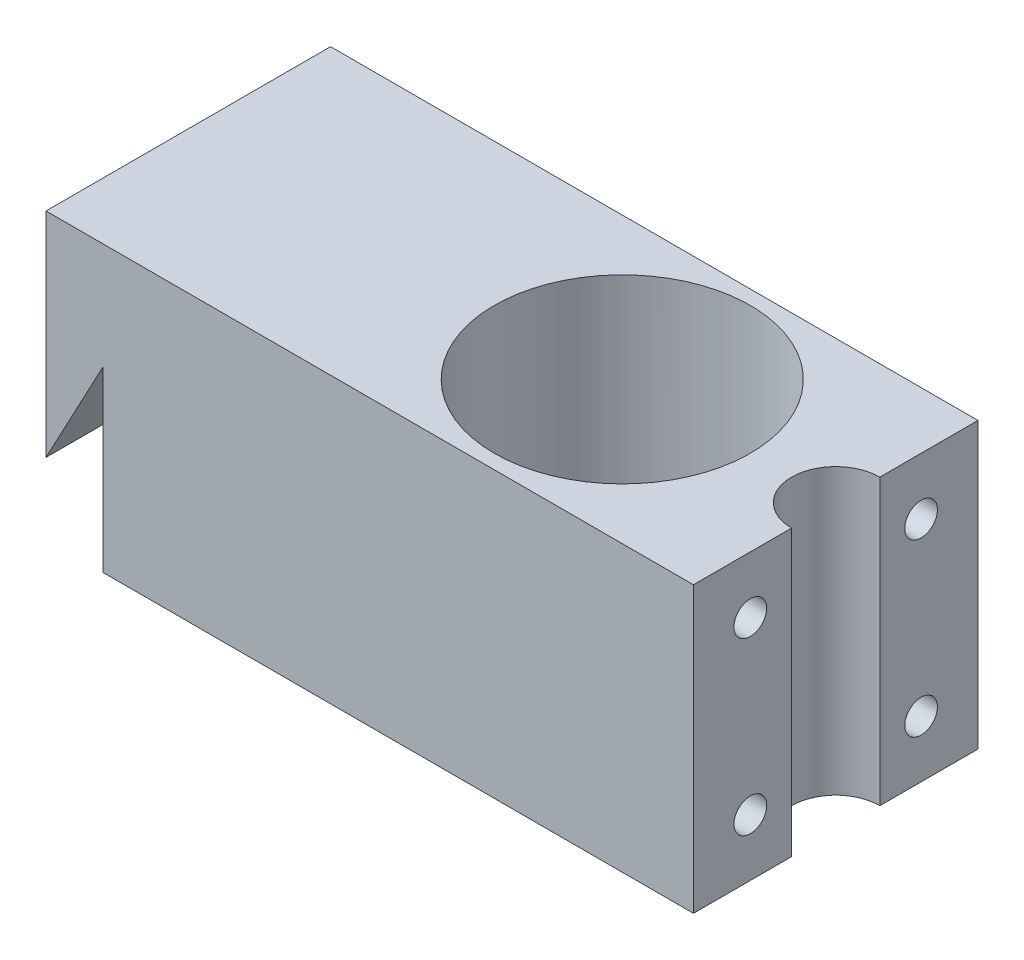
ISO-10303-21;
HEADER;
FILE_DESCRIPTION(('STEP AP214'),'2;1');
FILE_NAME('part.step','',(''),(''),'','','');
FILE_SCHEMA(('AUTOMOTIVE_DESIGN { 1 0 10303 214 1 1 1 1 }'));
ENDSEC;
DATA;
#1=APPLICATION_CONTEXT('core data for automotive mechanical design processes');
#2=APPLICATION_PROTOCOL_DEFINITION('international standard','automotive_design',2000,#1);
#3=PRODUCT_CONTEXT('',#1,'mechanical');
#4=PRODUCT('Part','Part','',(#3));
#5=PRODUCT_RELATED_PRODUCT_CATEGORY('part','',(#4));
#6=PRODUCT_DEFINITION_FORMATION('','',#4);
#7=PRODUCT_DEFINITION_CONTEXT('part definition',#1,'design');
#8=PRODUCT_DEFINITION('design','',#6,#7);
#9=PRODUCT_DEFINITION_SHAPE('','',#8);
#10=(LENGTH_UNIT() NAMED_UNIT(*) SI_UNIT(.MILLI.,.METRE.));
#11=(NAMED_UNIT(*) PLANE_ANGLE_UNIT() SI_UNIT($,.RADIAN.));
#12=(NAMED_UNIT(*) SI_UNIT($,.STERADIAN.) SOLID_ANGLE_UNIT());
#13=UNCERTAINTY_MEASURE_WITH_UNIT(LENGTH_MEASURE(1.E-05),#10,'distance_accuracy_value','');
#14=(GEOMETRIC_REPRESENTATION_CONTEXT(3) GLOBAL_UNCERTAINTY_ASSIGNED_CONTEXT((#13)) GLOBAL_UNIT_ASSIGNED_CONTEXT((#10,
#11,#12)) REPRESENTATION_CONTEXT('',''));
#15=CARTESIAN_POINT('',(0.,0.,0.));
#16=DIRECTION('',(0.,0.,1.));
#17=DIRECTION('',(1.,0.,0.));
#18=AXIS2_PLACEMENT_3D('',#15,#16,#17);
#19=CARTESIAN_POINT('',(25.5,-10.,10.));
#20=DIRECTION('',(-1.,0.,0.));
#21=DIRECTION('',(0.,0.,1.));
#22=AXIS2_PLACEMENT_3D('',#19,#20,#21);
#23=PLANE('',#22);
#24=CARTESIAN_POINT('',(25.5,-6.,6.));
#25=DIRECTION('',(1.,0.,0.));
#26=DIRECTION('',(0.,0.,-1.));
#27=AXIS2_PLACEMENT_3D('',#24,#25,#26);
#28=CIRCLE('',#27,1.15);
#29=CARTESIAN_POINT('',(25.5,-6.,4.85));
#30=VERTEX_POINT('',#29);
#31=EDGE_CURVE('E307',#30,#30,#28,.T.);
#32=ORIENTED_EDGE('',*,*,#31,.F.);
#33=EDGE_LOOP('',(#32));
#34=FACE_BOUND('',#33,.T.);
#35=CARTESIAN_POINT('',(25.5,6.,6.));
#36=DIRECTION('',(1.,0.,0.));
#37=DIRECTION('',(0.,0.,-1.));
#38=AXIS2_PLACEMENT_3D('',#35,#36,#37);
#39=CIRCLE('',#38,1.15);
#40=CARTESIAN_POINT('',(25.5,6.,4.85));
#41=VERTEX_POINT('',#40);
#42=EDGE_CURVE('E192',#41,#41,#39,.T.);
#43=ORIENTED_EDGE('',*,*,#42,.F.);
#44=EDGE_LOOP('',(#43));
#45=FACE_BOUND('',#44,.T.);
#46=DIRECTION('',(0.,0.,-1.));
#47=VECTOR('',#46,1.);
#48=CARTESIAN_POINT('',(25.5,-10.,10.));
#49=LINE('',#48,#47);
#50=CARTESIAN_POINT('',(25.5,-10.,10.));
#51=VERTEX_POINT('',#50);
#52=CARTESIAN_POINT('',(25.5,-10.,3.1));
#53=VERTEX_POINT('',#52);
#54=EDGE_CURVE('E58',#51,#53,#49,.T.);
#55=ORIENTED_EDGE('',*,*,#54,.T.);
#56=DIRECTION('',(0.,1.,0.));
#57=VECTOR('',#56,1.);
#58=CARTESIAN_POINT('',(25.5,-10.001,3.1));
#59=LINE('',#58,#57);
#60=CARTESIAN_POINT('',(25.5,10.,3.1));
#61=VERTEX_POINT('',#60);
#62=EDGE_CURVE('E292',#61,#53,#59,.F.);
#63=ORIENTED_EDGE('',*,*,#62,.F.);
#64=DIRECTION('',(0.,0.,-1.));
#65=VECTOR('',#64,1.);
#66=CARTESIAN_POINT('',(25.5,10.,10.));
#67=LINE('',#66,#65);
#68=CARTESIAN_POINT('',(25.5,10.,10.));
#69=VERTEX_POINT('',#68);
#70=EDGE_CURVE('E176',#69,#61,#67,.T.);
#71=ORIENTED_EDGE('',*,*,#70,.F.);
#72=DIRECTION('',(0.,1.,0.));
#73=VECTOR('',#72,1.);
#74=CARTESIAN_POINT('',(25.5,-10.,10.));
#75=LINE('',#74,#73);
#76=EDGE_CURVE('E126',#51,#69,#75,.T.);
#77=ORIENTED_EDGE('',*,*,#76,.F.);
#78=EDGE_LOOP('',(#55,#63,#71,#77));
#79=FACE_BOUND('',#78,.T.);
#80=ADVANCED_FACE('F43',(#34,#45,#79),#23,.F.);
#81=CARTESIAN_POINT('',(-16.0000000000001,2.5,10.));
#82=DIRECTION('',(1.,0.,0.));
#83=DIRECTION('',(0.,1.,0.));
#84=AXIS2_PLACEMENT_3D('',#81,#82,#83);
#85=PLANE('',#84);
#86=DIRECTION('',(0.,-1.,0.));
#87=VECTOR('',#86,1.);
#88=CARTESIAN_POINT('',(-16.0000000000001,2.5,-10.));
#89=LINE('',#88,#87);
#90=CARTESIAN_POINT('',(-16.0000000000001,2.5,-10.));
#91=VERTEX_POINT('',#90);
#92=CARTESIAN_POINT('',(-16.,-9.99999999999999,-10.));
#93=VERTEX_POINT('',#92);
#94=EDGE_CURVE('E151',#91,#93,#89,.T.);
#95=ORIENTED_EDGE('',*,*,#94,.T.);
#96=DIRECTION('',(0.,0.,-1.));
#97=VECTOR('',#96,1.);
#98=CARTESIAN_POINT('',(-16.,-9.99999999999999,10.));
#99=LINE('',#98,#97);
#100=CARTESIAN_POINT('',(-16.,-9.99999999999999,10.));
#101=VERTEX_POINT('',#100);
#102=EDGE_CURVE('E11',#101,#93,#99,.T.);
#103=ORIENTED_EDGE('',*,*,#102,.F.);
#104=DIRECTION('',(0.,-1.,0.));
#105=VECTOR('',#104,1.);
#106=CARTESIAN_POINT('',(-16.0000000000001,2.5,10.));
#107=LINE('',#106,#105);
#108=CARTESIAN_POINT('',(-16.0000000000001,2.5,10.));
#109=VERTEX_POINT('',#108);
#110=EDGE_CURVE('E171',#109,#101,#107,.T.);
#111=ORIENTED_EDGE('',*,*,#110,.F.);
#112=DIRECTION('',(0.,0.,-1.));
#113=VECTOR('',#112,1.);
#114=CARTESIAN_POINT('',(-16.0000000000001,2.5,10.));
#115=LINE('',#114,#113);
#116=EDGE_CURVE('E147',#109,#91,#115,.T.);
#117=ORIENTED_EDGE('',*,*,#116,.T.);
#118=EDGE_LOOP('',(#95,#103,#111,#117));
#119=FACE_BOUND('',#118,.T.);
#120=ADVANCED_FACE('F45',(#119),#85,.F.);
#121=CARTESIAN_POINT('',(-16.,-9.99999999999999,10.));
#122=DIRECTION('',(0.,1.,0.));
#123=DIRECTION('',(-1.,0.,0.));
#124=AXIS2_PLACEMENT_3D('',#121,#122,#123);
#125=PLANE('',#124);
#126=CARTESIAN_POINT('',(10.4999999999999,-10.,0.));
#127=DIRECTION('',(0.,1.,0.));
#128=DIRECTION('',(-1.,0.,0.));
#129=AXIS2_PLACEMENT_3D('',#126,#127,#128);
#130=CIRCLE('',#129,9.);
#131=CARTESIAN_POINT('',(1.49999999999995,-10.,0.));
#132=VERTEX_POINT('',#131);
#133=EDGE_CURVE('E156',#132,#132,#130,.F.);
#134=ORIENTED_EDGE('',*,*,#133,.F.);
#135=EDGE_LOOP('',(#134));
#136=FACE_BOUND('',#135,.T.);
#137=CARTESIAN_POINT('',(25.5,-10.,-3.1));
#138=VERTEX_POINT('',#137);
#139=CARTESIAN_POINT('',(25.5,-10.,-10.));
#140=VERTEX_POINT('',#139);
#141=EDGE_CURVE('E179',#138,#140,#49,.T.);
#142=ORIENTED_EDGE('',*,*,#141,.F.);
#143=CARTESIAN_POINT('',(25.5,-10.,0.));
#144=DIRECTION('',(0.,1.,0.));
#145=DIRECTION('',(-1.,0.,0.));
#146=AXIS2_PLACEMENT_3D('',#143,#144,#145);
#147=CIRCLE('',#146,3.1);
#148=EDGE_CURVE('E284',#53,#138,#147,.F.);
#149=ORIENTED_EDGE('',*,*,#148,.F.);
#150=ORIENTED_EDGE('',*,*,#54,.F.);
#151=DIRECTION('',(1.,0.,0.));
#152=VECTOR('',#151,1.);
#153=CARTESIAN_POINT('',(-16.,-9.99999999999999,10.));
#154=LINE('',#153,#152);
#155=EDGE_CURVE('E110',#101,#51,#154,.T.);
#156=ORIENTED_EDGE('',*,*,#155,.F.);
#157=ORIENTED_EDGE('',*,*,#102,.T.);
#158=DIRECTION('',(1.,0.,0.));
#159=VECTOR('',#158,1.);
#160=CARTESIAN_POINT('',(-16.,-9.99999999999999,-10.));
#161=LINE('',#160,#159);
#162=EDGE_CURVE('E155',#93,#140,#161,.T.);
#163=ORIENTED_EDGE('',*,*,#162,.T.);
#164=EDGE_LOOP('',(#142,#149,#150,#156,#157,#163));
#165=FACE_BOUND('',#164,.T.);
#166=ADVANCED_FACE('F245',(#136,#165),#125,.F.);
#167=CARTESIAN_POINT('',(25.5,6.,-6.));
#168=DIRECTION('',(1.,0.,0.));
#169=DIRECTION('',(0.,0.,-1.));
#170=AXIS2_PLACEMENT_3D('',#167,#168,#169);
#171=CIRCLE('',#170,1.15);
#172=CARTESIAN_POINT('',(25.5,6.,-7.15));
#173=VERTEX_POINT('',#172);
#174=EDGE_CURVE('E261',#173,#173,#171,.T.);
#175=ORIENTED_EDGE('',*,*,#174,.F.);
#176=EDGE_LOOP('',(#175));
#177=FACE_BOUND('',#176,.T.);
#178=CARTESIAN_POINT('',(25.5,-6.,-6.));
#179=DIRECTION('',(1.,0.,0.));
#180=DIRECTION('',(0.,0.,-1.));
#181=AXIS2_PLACEMENT_3D('',#178,#179,#180);
#182=CIRCLE('',#181,1.15);
#183=CARTESIAN_POINT('',(25.5,-6.,-7.15));
#184=VERTEX_POINT('',#183);
#185=EDGE_CURVE('E265',#184,#184,#182,.T.);
#186=ORIENTED_EDGE('',*,*,#185,.F.);
#187=EDGE_LOOP('',(#186));
#188=FACE_BOUND('',#187,.T.);
#189=CARTESIAN_POINT('',(25.5,10.,-3.1));
#190=VERTEX_POINT('',#189);
#191=CARTESIAN_POINT('',(25.5,10.,-10.));
#192=VERTEX_POINT('',#191);
#193=EDGE_CURVE('E140',#190,#192,#67,.T.);
#194=ORIENTED_EDGE('',*,*,#193,.F.);
#195=DIRECTION('',(0.,1.,0.));
#196=VECTOR('',#195,1.);
#197=CARTESIAN_POINT('',(25.5,-10.001,-3.1));
#198=LINE('',#197,#196);
#199=EDGE_CURVE('E66',#138,#190,#198,.T.);
#200=ORIENTED_EDGE('',*,*,#199,.F.);
#201=ORIENTED_EDGE('',*,*,#141,.T.);
#202=DIRECTION('',(0.,1.,0.));
#203=VECTOR('',#202,1.);
#204=CARTESIAN_POINT('',(25.5,-10.,-10.));
#205=LINE('',#204,#203);
#206=EDGE_CURVE('E160',#140,#192,#205,.T.);
#207=ORIENTED_EDGE('',*,*,#206,.T.);
#208=EDGE_LOOP('',(#194,#200,#201,#207));
#209=FACE_BOUND('',#208,.T.);
#210=ADVANCED_FACE('F239',(#177,#188,#209),#23,.F.);
#211=CARTESIAN_POINT('',(25.5,10.,10.));
#212=DIRECTION('',(0.,-1.,0.));
#213=DIRECTION('',(1.,0.,0.));
#214=AXIS2_PLACEMENT_3D('',#211,#212,#213);
#215=PLANE('',#214);
#216=CARTESIAN_POINT('',(10.4999999999999,10.,0.));
#217=DIRECTION('',(0.,1.,0.));
#218=DIRECTION('',(0.,0.,1.));
#219=AXIS2_PLACEMENT_3D('',#216,#217,#218);
#220=CIRCLE('',#219,9.);
#221=CARTESIAN_POINT('',(10.4999999999999,10.,9.));
#222=VERTEX_POINT('',#221);
#223=EDGE_CURVE('E288',#222,#222,#220,.T.);
#224=ORIENTED_EDGE('',*,*,#223,.F.);
#225=EDGE_LOOP('',(#224));
#226=FACE_BOUND('',#225,.T.);
#227=ORIENTED_EDGE('',*,*,#70,.T.);
#228=CARTESIAN_POINT('',(25.5,10.,0.));
#229=DIRECTION('',(0.,1.,0.));
#230=DIRECTION('',(0.,0.,1.));
#231=AXIS2_PLACEMENT_3D('',#228,#229,#230);
#232=CIRCLE('',#231,3.1);
#233=EDGE_CURVE('E289',#190,#61,#232,.T.);
#234=ORIENTED_EDGE('',*,*,#233,.F.);
#235=ORIENTED_EDGE('',*,*,#193,.T.);
#236=DIRECTION('',(-1.,0.,0.));
#237=VECTOR('',#236,1.);
#238=CARTESIAN_POINT('',(25.5,10.,-10.));
#239=LINE('',#238,#237);
#240=CARTESIAN_POINT('',(-20.,9.99999999999999,-10.));
#241=VERTEX_POINT('',#240);
#242=EDGE_CURVE('E136',#192,#241,#239,.T.);
#243=ORIENTED_EDGE('',*,*,#242,.T.);
#244=DIRECTION('',(0.,0.,-1.));
#245=VECTOR('',#244,1.);
#246=CARTESIAN_POINT('',(-20.,9.99999999999999,10.));
#247=LINE('',#246,#245);
#248=CARTESIAN_POINT('',(-20.,9.99999999999999,10.));
#249=VERTEX_POINT('',#248);
#250=EDGE_CURVE('E133',#249,#241,#247,.T.);
#251=ORIENTED_EDGE('',*,*,#250,.F.);
#252=DIRECTION('',(-1.,0.,0.));
#253=VECTOR('',#252,1.);
#254=CARTESIAN_POINT('',(25.5,10.,10.));
#255=LINE('',#254,#253);
#256=EDGE_CURVE('E119',#69,#249,#255,.T.);
#257=ORIENTED_EDGE('',*,*,#256,.F.);
#258=EDGE_LOOP('',(#227,#234,#235,#243,#251,#257));
#259=FACE_BOUND('',#258,.T.);
#260=ADVANCED_FACE('F134',(#226,#259),#215,.F.);
#261=CARTESIAN_POINT('',(-20.,9.99999999999999,10.));
#262=DIRECTION('',(1.,0.,0.));
#263=DIRECTION('',(0.,0.,-1.));
#264=AXIS2_PLACEMENT_3D('',#261,#262,#263);
#265=PLANE('',#264);
#266=DIRECTION('',(0.,-1.,0.));
#267=VECTOR('',#266,1.);
#268=CARTESIAN_POINT('',(-20.,9.99999999999999,-10.));
#269=LINE('',#268,#267);
#270=CARTESIAN_POINT('',(-20.,-4.99999999999999,-10.));
#271=VERTEX_POINT('',#270);
#272=EDGE_CURVE('E166',#241,#271,#269,.T.);
#273=ORIENTED_EDGE('',*,*,#272,.T.);
#274=DIRECTION('',(0.,0.,-1.));
#275=VECTOR('',#274,1.);
#276=CARTESIAN_POINT('',(-20.,-4.99999999999999,10.));
#277=LINE('',#276,#275);
#278=CARTESIAN_POINT('',(-20.,-4.99999999999999,10.));
#279=VERTEX_POINT('',#278);
#280=EDGE_CURVE('E141',#279,#271,#277,.T.);
#281=ORIENTED_EDGE('',*,*,#280,.F.);
#282=DIRECTION('',(0.,-1.,0.));
#283=VECTOR('',#282,1.);
#284=CARTESIAN_POINT('',(-20.,9.99999999999999,10.));
#285=LINE('',#284,#283);
#286=EDGE_CURVE('E123',#249,#279,#285,.T.);
#287=ORIENTED_EDGE('',*,*,#286,.F.);
#288=ORIENTED_EDGE('',*,*,#250,.T.);
#289=EDGE_LOOP('',(#273,#281,#287,#288));
#290=FACE_BOUND('',#289,.T.);
#291=ADVANCED_FACE('F143',(#290),#265,.F.);
#292=CARTESIAN_POINT('',(-20.,-4.99999999999999,10.));
#293=DIRECTION('',(-0.882352941176474,0.47058823529411,0.));
#294=DIRECTION('',(-0.470588235294111,-0.882352941176475,0.));
#295=AXIS2_PLACEMENT_3D('',#292,#293,#294);
#296=PLANE('',#295);
#297=DIRECTION('',(0.47058823529411,0.882352941176474,0.));
#298=VECTOR('',#297,1.);
#299=CARTESIAN_POINT('',(-20.,-4.99999999999999,-10.));
#300=LINE('',#299,#298);
#301=EDGE_CURVE('E102',#271,#91,#300,.T.);
#302=ORIENTED_EDGE('',*,*,#301,.T.);
#303=ORIENTED_EDGE('',*,*,#116,.F.);
#304=DIRECTION('',(0.47058823529411,0.882352941176474,0.));
#305=VECTOR('',#304,1.);
#306=CARTESIAN_POINT('',(-20.,-4.99999999999999,10.));
#307=LINE('',#306,#305);
#308=EDGE_CURVE('E75',#279,#109,#307,.T.);
#309=ORIENTED_EDGE('',*,*,#308,.F.);
#310=ORIENTED_EDGE('',*,*,#280,.T.);
#311=EDGE_LOOP('',(#302,#303,#309,#310));
#312=FACE_BOUND('',#311,.T.);
#313=ADVANCED_FACE('F277',(#312),#296,.F.);
#314=CARTESIAN_POINT('',(0.,0.,10.));
#315=DIRECTION('',(0.,0.,1.));
#316=DIRECTION('',(1.,0.,0.));
#317=AXIS2_PLACEMENT_3D('',#314,#315,#316);
#318=PLANE('',#317);
#319=ORIENTED_EDGE('',*,*,#110,.T.);
#320=ORIENTED_EDGE('',*,*,#155,.T.);
#321=ORIENTED_EDGE('',*,*,#76,.T.);
#322=ORIENTED_EDGE('',*,*,#256,.T.);
#323=ORIENTED_EDGE('',*,*,#286,.T.);
#324=ORIENTED_EDGE('',*,*,#308,.T.);
#325=EDGE_LOOP('',(#319,#320,#321,#322,#323,#324));
#326=FACE_BOUND('',#325,.T.);
#327=ADVANCED_FACE('F121',(#326),#318,.T.);
#328=CARTESIAN_POINT('',(0.,0.,-10.));
#329=DIRECTION('',(0.,0.,1.));
#330=DIRECTION('',(1.,0.,0.));
#331=AXIS2_PLACEMENT_3D('',#328,#329,#330);
#332=PLANE('',#331);
#333=ORIENTED_EDGE('',*,*,#94,.F.);
#334=ORIENTED_EDGE('',*,*,#301,.F.);
#335=ORIENTED_EDGE('',*,*,#272,.F.);
#336=ORIENTED_EDGE('',*,*,#242,.F.);
#337=ORIENTED_EDGE('',*,*,#206,.F.);
#338=ORIENTED_EDGE('',*,*,#162,.F.);
#339=EDGE_LOOP('',(#333,#334,#335,#336,#337,#338));
#340=FACE_BOUND('',#339,.T.);
#341=ADVANCED_FACE('F276',(#340),#332,.F.);
#342=CARTESIAN_POINT('',(25.5,-10.001,0.));
#343=DIRECTION('',(0.,1.,0.));
#344=DIRECTION('',(0.,0.,1.));
#345=AXIS2_PLACEMENT_3D('',#342,#343,#344);
#346=CYLINDRICAL_SURFACE('',#345,3.1);
#347=ORIENTED_EDGE('',*,*,#62,.T.);
#348=ORIENTED_EDGE('',*,*,#148,.T.);
#349=ORIENTED_EDGE('',*,*,#199,.T.);
#350=ORIENTED_EDGE('',*,*,#233,.T.);
#351=EDGE_LOOP('',(#347,#348,#349,#350));
#352=FACE_BOUND('',#351,.T.);
#353=ADVANCED_FACE('F317',(#352),#346,.F.);
#354=CARTESIAN_POINT('',(10.4999999999999,-10.001,0.));
#355=DIRECTION('',(0.,1.,0.));
#356=DIRECTION('',(0.,0.,1.));
#357=AXIS2_PLACEMENT_3D('',#354,#355,#356);
#358=CYLINDRICAL_SURFACE('',#357,9.);
#359=CARTESIAN_POINT('',(15.9660314671615,6.,-7.15));
#360=CARTESIAN_POINT('',(15.9660394606917,6.04810864538917,-7.14999458318255));
#361=CARTESIAN_POINT('',(15.9700367461879,6.09626515916895,-7.14694348603548));
#362=CARTESIAN_POINT('',(15.98548769309,6.19065404627445,-7.13509013053239));
#363=CARTESIAN_POINT('',(15.9969569772585,6.23688217167912,-7.12627582207606));
#364=CARTESIAN_POINT('',(16.0258411211232,6.32553504254716,-7.1039006438662));
#365=CARTESIAN_POINT('',(16.0431869292486,6.36799704187106,-7.09039485622625));
#366=CARTESIAN_POINT('',(16.0824365895949,6.44919552087034,-7.05953451958653));
#367=CARTESIAN_POINT('',(16.1043422180108,6.4879305401453,-7.04217847061385));
#368=CARTESIAN_POINT('',(16.1657048528361,6.58382373760782,-6.99300413468881));
#369=CARTESIAN_POINT('',(16.2077935331096,6.63804911086695,-6.95876625045929));
#370=CARTESIAN_POINT('',(16.2971434147921,6.73756550959318,-6.884514647776));
#371=CARTESIAN_POINT('',(16.3444194524526,6.78282981283289,-6.84448425241573));
#372=CARTESIAN_POINT('',(16.4644467603052,6.88408278640531,-6.7404900876486));
#373=CARTESIAN_POINT('',(16.5389154828209,6.93543095217591,-6.67398564115379));
#374=CARTESIAN_POINT('',(16.6903446612919,7.02193740333729,-6.53378466397801));
#375=CARTESIAN_POINT('',(16.7673073469108,7.05708074850775,-6.4600815719706));
#376=CARTESIAN_POINT('',(16.9230394561145,7.11183278900748,-6.30530536070699));
#377=CARTESIAN_POINT('',(17.0018107476614,7.13107601887361,-6.22410416840132));
#378=CARTESIAN_POINT('',(17.1572470588262,7.15161254771259,-6.05755686410284));
#379=CARTESIAN_POINT('',(17.2339141897998,7.15292454942484,-5.97221516405243));
#380=CARTESIAN_POINT('',(17.369289723375,7.13732510626106,-5.81562896858516));
#381=CARTESIAN_POINT('',(17.4287104893912,7.12371611226082,-5.74467383475882));
#382=CARTESIAN_POINT('',(17.5433150979417,7.08200509936126,-5.60356396150805));
#383=CARTESIAN_POINT('',(17.598503798963,7.05391999435838,-5.53340838544303));
#384=CARTESIAN_POINT('',(17.6926023408491,6.98923016609829,-5.41029131927706));
#385=CARTESIAN_POINT('',(17.7325712045042,6.9554153947979,-5.35667686831525));
#386=CARTESIAN_POINT('',(17.8076619110724,6.87738222834981,-5.25377180165774));
#387=CARTESIAN_POINT('',(17.842789006038,6.83317524917883,-5.20447652228635));
#388=CARTESIAN_POINT('',(17.902045000896,6.74224197228061,-5.11976395159099));
#389=CARTESIAN_POINT('',(17.9270347513204,6.696979567221,-5.08338089310015));
#390=CARTESIAN_POINT('',(17.9720305236695,6.59973832647014,-5.01700790792318));
#391=CARTESIAN_POINT('',(17.9920379470792,6.54776138578107,-4.98701618375377));
#392=CARTESIAN_POINT('',(18.0264807498145,6.43788550103512,-4.93488364772603));
#393=CARTESIAN_POINT('',(18.0408844186719,6.37995513471937,-4.91278757144108));
#394=CARTESIAN_POINT('',(18.0633833190781,6.26015095551142,-4.87808042706362));
#395=CARTESIAN_POINT('',(18.0714816878252,6.19827912029401,-4.86546464216705));
#396=CARTESIAN_POINT('',(18.0805419188523,6.07927107145306,-4.85133431822312));
#397=CARTESIAN_POINT('',(18.0821516609939,6.02230163847673,-4.84881215817422));
#398=CARTESIAN_POINT('',(18.079970053278,5.90873176429521,-4.85222207212399));
#399=CARTESIAN_POINT('',(18.0761803903954,5.85213121338728,-4.85815150553084));
#400=CARTESIAN_POINT('',(18.0635880170998,5.74317422426716,-4.87773125493251));
#401=CARTESIAN_POINT('',(18.0549853910099,5.69073831970341,-4.89107327009689));
#402=CARTESIAN_POINT('',(18.0331897148973,5.58911433578404,-4.92457607068286));
#403=CARTESIAN_POINT('',(18.0199962831438,5.53992652691614,-4.94473742313638));
#404=CARTESIAN_POINT('',(17.9887248453098,5.4437775123302,-4.99197688376506));
#405=CARTESIAN_POINT('',(17.9704579812817,5.39700858925289,-5.01931957745087));
#406=CARTESIAN_POINT('',(17.9298410666448,5.3089439886218,-5.07924904804782));
#407=CARTESIAN_POINT('',(17.9074895637273,5.26765026683626,-5.11183768968291));
#408=CARTESIAN_POINT('',(17.8564867481868,5.18661403470749,-5.18500771071706));
#409=CARTESIAN_POINT('',(17.8274079566403,5.14758302623066,-5.22607663703891));
#410=CARTESIAN_POINT('',(17.7655651934967,5.07704149377938,-5.31171889355702));
#411=CARTESIAN_POINT('',(17.7327993131144,5.04553489174413,-5.35629403527398));
#412=CARTESIAN_POINT('',(17.6583319241544,4.98512230851228,-5.45552519871537));
#413=CARTESIAN_POINT('',(17.6160634032288,4.95759899495026,-5.51059514091128));
#414=CARTESIAN_POINT('',(17.528305747214,4.91219536338854,-5.62209641836471));
#415=CARTESIAN_POINT('',(17.4828146708969,4.89432091459541,-5.67852856046889));
#416=CARTESIAN_POINT('',(17.3794734191549,4.86472664812119,-5.80350981483837));
#417=CARTESIAN_POINT('',(17.3210510022481,4.85512155788225,-5.87208575642357));
#418=CARTESIAN_POINT('',(17.2018411587463,4.84801763525284,-6.00778746017404));
#419=CARTESIAN_POINT('',(17.1410518873978,4.85052844138596,-6.07491202507872));
#420=CARTESIAN_POINT('',(17.0051388535552,4.86848274531281,-6.22053535515711));
#421=CARTESIAN_POINT('',(16.9297085135779,4.88655535796193,-6.29842827333566));
#422=CARTESIAN_POINT('',(16.7787613412297,4.93824899734236,-6.44891631125626));
#423=CARTESIAN_POINT('',(16.7032444882881,4.97188260573105,-6.52150708892087));
#424=CARTESIAN_POINT('',(16.5641628536397,5.0493053225605,-6.65084602670386));
#425=CARTESIAN_POINT('',(16.5003203620881,5.0912062396133,-6.70842701214039));
#426=CARTESIAN_POINT('',(16.3765985866355,5.18748912316306,-6.81705991093822));
#427=CARTESIAN_POINT('',(16.3167113714875,5.24184507104224,-6.8681250943925));
#428=CARTESIAN_POINT('',(16.2255601336383,5.34154388940361,-6.94406790988485));
#429=CARTESIAN_POINT('',(16.1919440874376,5.38270113546732,-6.97161450212403));
#430=CARTESIAN_POINT('',(16.1292935598787,5.47086342042312,-7.02229768088814));
#431=CARTESIAN_POINT('',(16.1002530911778,5.51786067083677,-7.04544003893374));
#432=CARTESIAN_POINT('',(16.0547131666847,5.60645418622912,-7.08137057966124));
#433=CARTESIAN_POINT('',(16.0368624669081,5.64687743846672,-7.095316828231));
#434=CARTESIAN_POINT('',(16.0065016224045,5.73085205361523,-7.11890526178536));
#435=CARTESIAN_POINT('',(15.9939799469486,5.77439642199302,-7.12855674170373));
#436=CARTESIAN_POINT('',(15.9786068960334,5.84852338623441,-7.14037293243283));
#437=CARTESIAN_POINT('',(15.9739169664512,5.87850524632107,-7.14396596188106));
#438=CARTESIAN_POINT('',(15.9676265575364,5.93898494853418,-7.14878133585678));
#439=CARTESIAN_POINT('',(15.9660263965591,5.96948284350392,-7.15000343609479));
#440=CARTESIAN_POINT('',(15.9660314671615,6.,-7.15));
#441=B_SPLINE_CURVE_WITH_KNOTS('',3,(#359,#360,#361,#362,#363,#364,#365,#366,#367,#368,#369,
#370,#371,#372,#373,#374,#375,#376,#377,#378,#379,#380,#381,#382,#383,#384,#385,#386,#387,#388,
#389,#390,#391,#392,#393,#394,#395,#396,#397,#398,#399,#400,#401,#402,#403,#404,#405,#406,#407,
#408,#409,#410,#411,#412,#413,#414,#415,#416,#417,#418,#419,#420,#421,#422,#423,#424,#425,#426,
#427,#428,#429,#430,#431,#432,#433,#434,#435,#436,#437,#438,#439,#440),.UNSPECIFIED.,.T.,.F.,(4,
2,2,2,2,2,2,2,2,2,2,2,2,2,2,2,2,2,2,2,2,2,2,2,2,2,2,2,2,2,2,2,2,2,2,2,2,2,2,2,4),(0.,
0.144168235792563,0.288638876091866,0.431467637938625,0.574352140595051,0.803181255176676,
1.03268279455068,1.36772376283196,1.7030730113784,2.04593125627073,2.38843186373236,
2.66803290616319,2.94730800062927,3.17125792172379,3.39496297110029,3.58383786521839,
3.77265957031501,3.96253475400968,4.15231540494613,4.32259252681567,4.49281645944584,
4.65643977803314,4.82007670534234,4.99089077976147,5.16176570634986,5.35208935382723,
5.54251198805919,5.76573361673332,5.98909087398034,6.25990708564631,6.53093877444182,
6.85943443137085,7.18819615495264,7.47422636228484,7.75966441240302,7.93876982361753,
8.11763888546415,8.25616037198746,8.39438058831625,8.48582260115864,8.57727403525857),.UNSPECIFIED.);
#442=CARTESIAN_POINT('',(15.9660314671615,6.,-7.15));
#443=VERTEX_POINT('',#442);
#444=EDGE_CURVE('E47',#443,#443,#441,.T.);
#445=ORIENTED_EDGE('',*,*,#444,.T.);
#446=EDGE_LOOP('',(#445));
#447=FACE_BOUND('',#446,.T.);
#448=CARTESIAN_POINT('',(15.9660314671615,-6.,-7.15));
#449=CARTESIAN_POINT('',(15.9660394606917,-5.95189135461083,-7.14999458318255));
#450=CARTESIAN_POINT('',(15.9700367461879,-5.90373484083104,-7.14694348603548));
#451=CARTESIAN_POINT('',(15.98548769309,-5.80934595372555,-7.13509013053239));
#452=CARTESIAN_POINT('',(15.9969569772585,-5.76311782832088,-7.12627582207606));
#453=CARTESIAN_POINT('',(16.0258411211232,-5.67446495745284,-7.1039006438662));
#454=CARTESIAN_POINT('',(16.0431869292486,-5.63200295812893,-7.09039485622625));
#455=CARTESIAN_POINT('',(16.0824365895949,-5.55080447912966,-7.05953451958653));
#456=CARTESIAN_POINT('',(16.1043422180108,-5.5120694598547,-7.04217847061385));
#457=CARTESIAN_POINT('',(16.1657048528361,-5.41617626239217,-6.99300413468881));
#458=CARTESIAN_POINT('',(16.2077935331096,-5.36195088913305,-6.95876625045929));
#459=CARTESIAN_POINT('',(16.2971434147921,-5.26243449040682,-6.884514647776));
#460=CARTESIAN_POINT('',(16.3444194524526,-5.21717018716711,-6.84448425241573));
#461=CARTESIAN_POINT('',(16.4644467603052,-5.11591721359468,-6.7404900876486));
#462=CARTESIAN_POINT('',(16.5389154828209,-5.06456904782409,-6.67398564115379));
#463=CARTESIAN_POINT('',(16.6903446612919,-4.97806259666271,-6.53378466397801));
#464=CARTESIAN_POINT('',(16.7673073469108,-4.94291925149225,-6.4600815719706));
#465=CARTESIAN_POINT('',(16.9230394561145,-4.88816721099252,-6.30530536070699));
#466=CARTESIAN_POINT('',(17.0018107476614,-4.86892398112638,-6.22410416840132));
#467=CARTESIAN_POINT('',(17.1572470588262,-4.84838745228741,-6.05755686410284));
#468=CARTESIAN_POINT('',(17.2339141897998,-4.84707545057515,-5.97221516405243));
#469=CARTESIAN_POINT('',(17.369289723375,-4.86267489373894,-5.81562896858516));
#470=CARTESIAN_POINT('',(17.4287104893912,-4.87628388773917,-5.74467383475882));
#471=CARTESIAN_POINT('',(17.5433150979417,-4.91799490063874,-5.60356396150805));
#472=CARTESIAN_POINT('',(17.598503798963,-4.94608000564162,-5.53340838544303));
#473=CARTESIAN_POINT('',(17.6926023408491,-5.0107698339017,-5.41029131927706));
#474=CARTESIAN_POINT('',(17.7325712045042,-5.0445846052021,-5.35667686831525));
#475=CARTESIAN_POINT('',(17.8076619110724,-5.12261777165019,-5.25377180165774));
#476=CARTESIAN_POINT('',(17.842789006038,-5.16682475082117,-5.20447652228635));
#477=CARTESIAN_POINT('',(17.902045000896,-5.25775802771938,-5.11976395159099));
#478=CARTESIAN_POINT('',(17.9270347513204,-5.30302043277899,-5.08338089310015));
#479=CARTESIAN_POINT('',(17.9720305236695,-5.40026167352986,-5.01700790792318));
#480=CARTESIAN_POINT('',(17.9920379470792,-5.45223861421893,-4.98701618375377));
#481=CARTESIAN_POINT('',(18.0264807498145,-5.56211449896488,-4.93488364772603));
#482=CARTESIAN_POINT('',(18.0408844186719,-5.62004486528063,-4.91278757144108));
#483=CARTESIAN_POINT('',(18.0633833190781,-5.73984904448858,-4.87808042706362));
#484=CARTESIAN_POINT('',(18.0714816878252,-5.80172087970599,-4.86546464216705));
#485=CARTESIAN_POINT('',(18.0805419188523,-5.92072892854694,-4.85133431822312));
#486=CARTESIAN_POINT('',(18.0821516609939,-5.97769836152327,-4.84881215817422));
#487=CARTESIAN_POINT('',(18.079970053278,-6.09126823570479,-4.85222207212399));
#488=CARTESIAN_POINT('',(18.0761803903954,-6.14786878661272,-4.85815150553084));
#489=CARTESIAN_POINT('',(18.0635880170998,-6.25682577573284,-4.87773125493251));
#490=CARTESIAN_POINT('',(18.0549853910099,-6.30926168029658,-4.89107327009689));
#491=CARTESIAN_POINT('',(18.0331897148973,-6.41088566421596,-4.92457607068286));
#492=CARTESIAN_POINT('',(18.0199962831438,-6.46007347308386,-4.94473742313638));
#493=CARTESIAN_POINT('',(17.9887248453098,-6.5562224876698,-4.99197688376506));
#494=CARTESIAN_POINT('',(17.9704579812817,-6.60299141074711,-5.01931957745087));
#495=CARTESIAN_POINT('',(17.9298410666448,-6.69105601137819,-5.07924904804782));
#496=CARTESIAN_POINT('',(17.9074895637273,-6.73234973316373,-5.11183768968291));
#497=CARTESIAN_POINT('',(17.8564867481868,-6.81338596529251,-5.18500771071706));
#498=CARTESIAN_POINT('',(17.8274079566403,-6.85241697376933,-5.22607663703891));
#499=CARTESIAN_POINT('',(17.7655651934967,-6.92295850622061,-5.31171889355702));
#500=CARTESIAN_POINT('',(17.7327993131144,-6.95446510825586,-5.35629403527398));
#501=CARTESIAN_POINT('',(17.6583319241544,-7.01487769148771,-5.45552519871537));
#502=CARTESIAN_POINT('',(17.6160634032288,-7.04240100504973,-5.51059514091128));
#503=CARTESIAN_POINT('',(17.528305747214,-7.08780463661146,-5.62209641836471));
#504=CARTESIAN_POINT('',(17.4828146708969,-7.10567908540459,-5.67852856046889));
#505=CARTESIAN_POINT('',(17.3794734191549,-7.13527335187881,-5.80350981483837));
#506=CARTESIAN_POINT('',(17.3210510022481,-7.14487844211775,-5.87208575642357));
#507=CARTESIAN_POINT('',(17.2018411587463,-7.15198236474716,-6.00778746017404));
#508=CARTESIAN_POINT('',(17.1410518873978,-7.14947155861404,-6.07491202507872));
#509=CARTESIAN_POINT('',(17.0051388535552,-7.13151725468719,-6.22053535515711));
#510=CARTESIAN_POINT('',(16.9297085135779,-7.11344464203806,-6.29842827333566));
#511=CARTESIAN_POINT('',(16.7787613412297,-7.06175100265763,-6.44891631125626));
#512=CARTESIAN_POINT('',(16.7032444882881,-7.02811739426895,-6.52150708892087));
#513=CARTESIAN_POINT('',(16.5641628536397,-6.95069467743949,-6.65084602670386));
#514=CARTESIAN_POINT('',(16.5003203620881,-6.9087937603867,-6.70842701214039));
#515=CARTESIAN_POINT('',(16.3765985866355,-6.81251087683694,-6.81705991093822));
#516=CARTESIAN_POINT('',(16.3167113714875,-6.75815492895776,-6.8681250943925));
#517=CARTESIAN_POINT('',(16.2255601336383,-6.65845611059639,-6.94406790988485));
#518=CARTESIAN_POINT('',(16.1919440874376,-6.61729886453268,-6.97161450212403));
#519=CARTESIAN_POINT('',(16.1292935598787,-6.52913657957687,-7.02229768088814));
#520=CARTESIAN_POINT('',(16.1002530911778,-6.48213932916323,-7.04544003893374));
#521=CARTESIAN_POINT('',(16.0547131666847,-6.39354581377087,-7.08137057966124));
#522=CARTESIAN_POINT('',(16.0368624669081,-6.35312256153327,-7.095316828231));
#523=CARTESIAN_POINT('',(16.0065016224045,-6.26914794638476,-7.11890526178536));
#524=CARTESIAN_POINT('',(15.9939799469486,-6.22560357800698,-7.12855674170373));
#525=CARTESIAN_POINT('',(15.9786068960334,-6.15147661376559,-7.14037293243283));
#526=CARTESIAN_POINT('',(15.9739169664512,-6.12149475367893,-7.14396596188106));
#527=CARTESIAN_POINT('',(15.9676265575364,-6.06101505146582,-7.14878133585678));
#528=CARTESIAN_POINT('',(15.9660263965591,-6.03051715649608,-7.15000343609479));
#529=CARTESIAN_POINT('',(15.9660314671615,-6.,-7.15));
#530=B_SPLINE_CURVE_WITH_KNOTS('',3,(#448,#449,#450,#451,#452,#453,#454,#455,#456,#457,#458,
#459,#460,#461,#462,#463,#464,#465,#466,#467,#468,#469,#470,#471,#472,#473,#474,#475,#476,#477,
#478,#479,#480,#481,#482,#483,#484,#485,#486,#487,#488,#489,#490,#491,#492,#493,#494,#495,#496,
#497,#498,#499,#500,#501,#502,#503,#504,#505,#506,#507,#508,#509,#510,#511,#512,#513,#514,#515,
#516,#517,#518,#519,#520,#521,#522,#523,#524,#525,#526,#527,#528,#529),.UNSPECIFIED.,.T.,.F.,(4,
2,2,2,2,2,2,2,2,2,2,2,2,2,2,2,2,2,2,2,2,2,2,2,2,2,2,2,2,2,2,2,2,2,2,2,2,2,2,2,4),(0.,
0.144168235792563,0.288638876091866,0.431467637938625,0.574352140595051,0.803181255176676,
1.03268279455068,1.36772376283196,1.7030730113784,2.04593125627073,2.38843186373236,
2.66803290616319,2.94730800062927,3.1712579217238,3.39496297110029,3.58383786521839,
3.77265957031501,3.96253475400968,4.15231540494613,4.32259252681567,4.49281645944584,
4.65643977803314,4.82007670534234,4.99089077976147,5.16176570634986,5.35208935382723,
5.54251198805919,5.76573361673332,5.98909087398034,6.25990708564631,6.53093877444182,
6.85943443137085,7.18819615495264,7.47422636228484,7.75966441240302,7.93876982361753,
8.11763888546415,8.25616037198746,8.39438058831625,8.48582260115864,8.57727403525857),.UNSPECIFIED.);
#531=CARTESIAN_POINT('',(15.9660314671615,-6.,-7.15));
#532=VERTEX_POINT('',#531);
#533=EDGE_CURVE('E215',#532,#532,#530,.T.);
#534=ORIENTED_EDGE('',*,*,#533,.T.);
#535=EDGE_LOOP('',(#534));
#536=FACE_BOUND('',#535,.T.);
#537=CARTESIAN_POINT('',(18.0813916928226,-6.,4.85));
#538=CARTESIAN_POINT('',(18.0813900119372,-5.94333113468828,4.85000362748289));
#539=CARTESIAN_POINT('',(18.0787004074526,-5.88660704020097,4.85421493110327));
#540=CARTESIAN_POINT('',(18.0680262286238,-5.77483720937554,4.87083890919859));
#541=CARTESIAN_POINT('',(18.0600335543719,-5.7197941754273,4.883264129502));
#542=CARTESIAN_POINT('',(18.0390560849896,-5.61316337880503,4.91558744038361));
#543=CARTESIAN_POINT('',(18.0260872917551,-5.56156515658825,4.9354615725106));
#544=CARTESIAN_POINT('',(17.9955674733674,-5.46286274628889,4.98168963731276));
#545=CARTESIAN_POINT('',(17.9780169271303,-5.41575808921052,5.00804289272909));
#546=CARTESIAN_POINT('',(17.9378893383679,-5.32475224720861,5.06745920941625));
#547=CARTESIAN_POINT('',(17.9151132361199,-5.28110927760883,5.10078140117321));
#548=CARTESIAN_POINT('',(17.8656690208344,-5.2001895314368,5.17192398134116));
#549=CARTESIAN_POINT('',(17.8389996143646,-5.16291487951171,5.20974586386235));
#550=CARTESIAN_POINT('',(17.7783157802629,-5.09007171702428,5.29425984659011));
#551=CARTESIAN_POINT('',(17.743796221821,-5.055502222554,5.3414480895333));
#552=CARTESIAN_POINT('',(17.6712484205216,-4.99478405084766,5.43846322678085));
#553=CARTESIAN_POINT('',(17.6332170467091,-4.96864298305504,5.48829245846376));
#554=CARTESIAN_POINT('',(17.5360856205271,-4.91418703536678,5.6126854714956));
#555=CARTESIAN_POINT('',(17.47538109438,-4.89046574051862,5.68802317341049));
#556=CARTESIAN_POINT('',(17.3498818735616,-4.85878418298703,5.83855932043219));
#557=CARTESIAN_POINT('',(17.2850821285548,-4.85084378912903,5.91375747104602));
#558=CARTESIAN_POINT('',(17.1521080803026,-4.84927380404354,6.06296665206666));
#559=CARTESIAN_POINT('',(17.0839009765876,-4.85583058730017,6.13694975922492));
#560=CARTESIAN_POINT('',(16.9462979955916,-4.88252534477538,6.28133976988534));
#561=CARTESIAN_POINT('',(16.8769008257138,-4.90267913544711,6.35174240579641));
#562=CARTESIAN_POINT('',(16.7251401789571,-4.96113259893263,6.50084024773294));
#563=CARTESIAN_POINT('',(16.6428256792949,-5.00215815617387,6.57855940914603));
#564=CARTESIAN_POINT('',(16.5223130994441,-5.07773764909089,6.68840281734247));
#565=CARTESIAN_POINT('',(16.4826489682994,-5.10525876771248,6.7238833481622));
#566=CARTESIAN_POINT('',(16.4048799043849,-5.16521808703859,6.79227946991313));
#567=CARTESIAN_POINT('',(16.3667736931391,-5.19765214882723,6.82519718488079));
#568=CARTESIAN_POINT('',(16.2904806921432,-5.27006724924378,6.89006549369567));
#569=CARTESIAN_POINT('',(16.2524531889589,-5.31040418660216,6.92181035611392));
#570=CARTESIAN_POINT('',(16.1805517275228,-5.39748493481775,6.98093752385834));
#571=CARTESIAN_POINT('',(16.1466718200827,-5.44421936041037,7.00832609501503));
#572=CARTESIAN_POINT('',(16.0918733112065,-5.53360143401747,7.05208542173484));
#573=CARTESIAN_POINT('',(16.0697358726881,-5.57495038528546,7.06955813367305));
#574=CARTESIAN_POINT('',(16.0308120065351,-5.66164007493061,7.10005148606247));
#575=CARTESIAN_POINT('',(16.014017380421,-5.70697455976454,7.11307894994391));
#576=CARTESIAN_POINT('',(15.9898198120116,-5.79227274249195,7.13176486531546));
#577=CARTESIAN_POINT('',(15.9812616248607,-5.83170452962455,7.13833476937419));
#578=CARTESIAN_POINT('',(15.9695394450686,-5.91182231709654,7.14732083209246));
#579=CARTESIAN_POINT('',(15.9663710678007,-5.95250727052043,7.14974036710319));
#580=CARTESIAN_POINT('',(15.9657435575168,-6.03401018369039,7.15022011604092));
#581=CARTESIAN_POINT('',(15.9682930415693,-6.07482825149037,7.14827375036283));
#582=CARTESIAN_POINT('',(15.9788542619575,-6.15532510752848,7.14018193798799));
#583=CARTESIAN_POINT('',(15.9868700391475,-6.19500303030739,7.13403338489593));
#584=CARTESIAN_POINT('',(16.0099987713836,-6.28099154355691,7.11619060731352));
#585=CARTESIAN_POINT('',(16.0263036589155,-6.32678300014003,7.10355918757979));
#586=CARTESIAN_POINT('',(16.0644197674471,-6.41440651049688,7.07374146809112));
#587=CARTESIAN_POINT('',(16.0862409558126,-6.45623120659366,7.05654692042138));
#588=CARTESIAN_POINT('',(16.1447651358141,-6.55383738627684,7.00989124758095));
#589=CARTESIAN_POINT('',(16.1837177841127,-6.60729095764469,6.97841127206905));
#590=CARTESIAN_POINT('',(16.2668523256856,-6.70586629401503,6.90987315347186));
#591=CARTESIAN_POINT('',(16.3110459638834,-6.75096874263102,6.87280242919796));
#592=CARTESIAN_POINT('',(16.4248059005125,-6.85356827788287,6.77529648541445));
#593=CARTESIAN_POINT('',(16.4962815371383,-6.90646583177415,6.7122501332179));
#594=CARTESIAN_POINT('',(16.6421703921787,-6.99684955720058,6.57902463221398));
#595=CARTESIAN_POINT('',(16.7165867944835,-7.0343184941103,6.50883761539632));
#596=CARTESIAN_POINT('',(16.8680384663756,-7.09494406487666,6.36078611415627));
#597=CARTESIAN_POINT('',(16.9450891531928,-7.11767521058124,6.28276275115519));
#598=CARTESIAN_POINT('',(17.0976837177807,-7.14637162023298,6.12231991154197));
#599=CARTESIAN_POINT('',(17.1732287080205,-7.15234975523823,6.03990385939688));
#600=CARTESIAN_POINT('',(17.3111064691235,-7.14640857785704,5.88372464645408));
#601=CARTESIAN_POINT('',(17.3738662948472,-7.13674916898341,5.81025660978901));
#602=CARTESIAN_POINT('',(17.495298237422,-7.10223062639857,5.66346446350142));
#603=CARTESIAN_POINT('',(17.5539747611512,-7.07738817142411,5.59014028439514));
#604=CARTESIAN_POINT('',(17.654010245414,-7.01794588890511,5.46126215492995));
#605=CARTESIAN_POINT('',(17.6964528313243,-6.98639208386945,5.40514783974224));
#606=CARTESIAN_POINT('',(17.7765386853043,-6.91233411392684,5.29683873314369));
#607=CARTESIAN_POINT('',(17.8141877383516,-6.86984333894179,5.24463924908813));
#608=CARTESIAN_POINT('',(17.8778443755867,-6.78173297562631,5.15460503379987));
#609=CARTESIAN_POINT('',(17.9047495750642,-6.73774249849131,5.11581421699223));
#610=CARTESIAN_POINT('',(17.953596831598,-6.64251612629062,5.04437978024791));
#611=CARTESIAN_POINT('',(17.9755384975826,-6.59127966083727,5.01173664471481));
#612=CARTESIAN_POINT('',(18.0138265091633,-6.48221521917737,4.95415201861377));
#613=CARTESIAN_POINT('',(18.030133758324,-6.42434475619473,4.92926445519034));
#614=CARTESIAN_POINT('',(18.0562613124218,-6.30404800109035,4.88912052986779));
#615=CARTESIAN_POINT('',(18.0660966196398,-6.2416326203339,4.87384189765882));
#616=CARTESIAN_POINT('',(18.0754536761909,-6.14876124336485,4.85927213725274));
#617=CARTESIAN_POINT('',(18.0776774410672,-6.11916467256534,4.85580188550451));
#618=CARTESIAN_POINT('',(18.0806468619841,-6.05971717436833,4.85116490826024));
#619=CARTESIAN_POINT('',(18.0813925787016,-6.02986625746279,4.84999808820351));
#620=CARTESIAN_POINT('',(18.0813916928226,-6.,4.85));
#621=B_SPLINE_CURVE_WITH_KNOTS('',3,(#537,#538,#539,#540,#541,#542,#543,#544,#545,#546,#547,
#548,#549,#550,#551,#552,#553,#554,#555,#556,#557,#558,#559,#560,#561,#562,#563,#564,#565,#566,
#567,#568,#569,#570,#571,#572,#573,#574,#575,#576,#577,#578,#579,#580,#581,#582,#583,#584,#585,
#586,#587,#588,#589,#590,#591,#592,#593,#594,#595,#596,#597,#598,#599,#600,#601,#602,#603,#604,
#605,#606,#607,#608,#609,#610,#611,#612,#613,#614,#615,#616,#617,#618,#619,#620),.UNSPECIFIED.,
.T.,.F.,(4,2,2,2,2,2,2,2,2,2,2,2,2,2,2,2,2,2,2,2,2,2,2,2,2,2,2,2,2,2,2,2,2,2,2,2,2,2,2,2,2,4),
(0.,0.169887265583049,0.340034616138413,0.509639341854803,0.679226346423812,0.856863664304012,
1.03456013167128,1.23756367804343,1.4407499923786,1.73797675469261,2.03557750166578,
2.33702639629766,2.63882655143697,2.99813347650903,3.17765973096782,3.35703557590041,
3.54819989023993,3.73908670895677,3.88873013026554,4.03814280543393,4.16025884438658,
4.28227549398109,4.4044761515766,4.52676724177021,4.67660419550577,4.8267138482926,
5.04524461793497,5.26427470785593,5.58954632672212,5.91518031283041,6.24984007909504,
6.58424266127361,6.87447124394825,7.16438157906785,7.39483475714787,7.62500712679419,
7.81779473984322,8.0105975371492,8.20471249503811,8.39837588474759,8.48791544218539,
8.57745132376062),.UNSPECIFIED.);
#622=CARTESIAN_POINT('',(18.0813916928226,-6.,4.85));
#623=VERTEX_POINT('',#622);
#624=EDGE_CURVE('E191',#623,#623,#621,.T.);
#625=ORIENTED_EDGE('',*,*,#624,.T.);
#626=EDGE_LOOP('',(#625));
#627=FACE_BOUND('',#626,.T.);
#628=CARTESIAN_POINT('',(18.0813916928226,6.,4.85));
#629=CARTESIAN_POINT('',(18.0813900119372,6.05666886531172,4.85000362748289));
#630=CARTESIAN_POINT('',(18.0787004074526,6.11339295979903,4.85421493110327));
#631=CARTESIAN_POINT('',(18.0680262286238,6.22516279062445,4.87083890919859));
#632=CARTESIAN_POINT('',(18.0600335543719,6.2802058245727,4.883264129502));
#633=CARTESIAN_POINT('',(18.0390560849896,6.38683662119496,4.91558744038361));
#634=CARTESIAN_POINT('',(18.0260872917551,6.43843484341175,4.9354615725106));
#635=CARTESIAN_POINT('',(17.9955674733674,6.53713725371111,4.98168963731276));
#636=CARTESIAN_POINT('',(17.9780169271303,6.58424191078947,5.00804289272909));
#637=CARTESIAN_POINT('',(17.9378893383679,6.67524775279139,5.06745920941625));
#638=CARTESIAN_POINT('',(17.9151132361199,6.71889072239116,5.10078140117321));
#639=CARTESIAN_POINT('',(17.8656690208344,6.79981046856319,5.17192398134116));
#640=CARTESIAN_POINT('',(17.8389996143646,6.83708512048829,5.20974586386235));
#641=CARTESIAN_POINT('',(17.7783157802629,6.90992828297571,5.29425984659011));
#642=CARTESIAN_POINT('',(17.743796221821,6.94449777744599,5.3414480895333));
#643=CARTESIAN_POINT('',(17.6712484205216,7.00521594915234,5.43846322678085));
#644=CARTESIAN_POINT('',(17.6332170467091,7.03135701694496,5.48829245846376));
#645=CARTESIAN_POINT('',(17.5360856205271,7.08581296463322,5.6126854714956));
#646=CARTESIAN_POINT('',(17.47538109438,7.10953425948138,5.68802317341049));
#647=CARTESIAN_POINT('',(17.3498818735616,7.14121581701297,5.83855932043219));
#648=CARTESIAN_POINT('',(17.2850821285548,7.14915621087097,5.91375747104602));
#649=CARTESIAN_POINT('',(17.1521080803026,7.15072619595646,6.06296665206666));
#650=CARTESIAN_POINT('',(17.0839009765876,7.14416941269983,6.13694975922492));
#651=CARTESIAN_POINT('',(16.9462979955916,7.11747465522462,6.28133976988534));
#652=CARTESIAN_POINT('',(16.8769008257138,7.09732086455289,6.35174240579641));
#653=CARTESIAN_POINT('',(16.7251401789571,7.03886740106737,6.50084024773294));
#654=CARTESIAN_POINT('',(16.6428256792949,6.99784184382612,6.57855940914603));
#655=CARTESIAN_POINT('',(16.5223130994441,6.92226235090911,6.68840281734247));
#656=CARTESIAN_POINT('',(16.4826489682994,6.89474123228751,6.7238833481622));
#657=CARTESIAN_POINT('',(16.4048799043849,6.8347819129614,6.79227946991313));
#658=CARTESIAN_POINT('',(16.3667736931391,6.80234785117276,6.82519718488079));
#659=CARTESIAN_POINT('',(16.2904806921432,6.72993275075622,6.89006549369567));
#660=CARTESIAN_POINT('',(16.2524531889589,6.68959581339784,6.92181035611392));
#661=CARTESIAN_POINT('',(16.1805517275228,6.60251506518225,6.98093752385834));
#662=CARTESIAN_POINT('',(16.1466718200827,6.55578063958963,7.00832609501503));
#663=CARTESIAN_POINT('',(16.0918733112065,6.46639856598253,7.05208542173484));
#664=CARTESIAN_POINT('',(16.0697358726881,6.42504961471454,7.06955813367305));
#665=CARTESIAN_POINT('',(16.0308120065351,6.33835992506939,7.10005148606247));
#666=CARTESIAN_POINT('',(16.014017380421,6.29302544023546,7.11307894994391));
#667=CARTESIAN_POINT('',(15.9898198120116,6.20772725750804,7.13176486531546));
#668=CARTESIAN_POINT('',(15.9812616248607,6.16829547037544,7.13833476937419));
#669=CARTESIAN_POINT('',(15.9695394450686,6.08817768290346,7.14732083209246));
#670=CARTESIAN_POINT('',(15.9663710678007,6.04749272947956,7.14974036710319));
#671=CARTESIAN_POINT('',(15.9657435575168,5.96598981630961,7.15022011604092));
#672=CARTESIAN_POINT('',(15.9682930415693,5.92517174850963,7.14827375036283));
#673=CARTESIAN_POINT('',(15.9788542619575,5.84467489247152,7.14018193798799));
#674=CARTESIAN_POINT('',(15.9868700391475,5.8049969696926,7.13403338489593));
#675=CARTESIAN_POINT('',(16.0099987713836,5.71900845644308,7.11619060731352));
#676=CARTESIAN_POINT('',(16.0263036589155,5.67321699985996,7.10355918757979));
#677=CARTESIAN_POINT('',(16.0644197674471,5.58559348950311,7.07374146809112));
#678=CARTESIAN_POINT('',(16.0862409558126,5.54376879340633,7.05654692042138));
#679=CARTESIAN_POINT('',(16.1447651358141,5.44616261372316,7.00989124758095));
#680=CARTESIAN_POINT('',(16.1837177841127,5.39270904235531,6.97841127206905));
#681=CARTESIAN_POINT('',(16.2668523256856,5.29413370598497,6.90987315347186));
#682=CARTESIAN_POINT('',(16.3110459638834,5.24903125736898,6.87280242919796));
#683=CARTESIAN_POINT('',(16.4248059005125,5.14643172211712,6.77529648541445));
#684=CARTESIAN_POINT('',(16.4962815371383,5.09353416822585,6.7122501332179));
#685=CARTESIAN_POINT('',(16.6421703921787,5.00315044279941,6.57902463221398));
#686=CARTESIAN_POINT('',(16.7165867944835,4.9656815058897,6.50883761539632));
#687=CARTESIAN_POINT('',(16.8680384663756,4.90505593512333,6.36078611415627));
#688=CARTESIAN_POINT('',(16.9450891531928,4.88232478941876,6.28276275115519));
#689=CARTESIAN_POINT('',(17.0976837177807,4.85362837976702,6.12231991154197));
#690=CARTESIAN_POINT('',(17.1732287080205,4.84765024476177,6.03990385939688));
#691=CARTESIAN_POINT('',(17.3111064691235,4.85359142214296,5.88372464645408));
#692=CARTESIAN_POINT('',(17.3738662948472,4.86325083101659,5.81025660978901));
#693=CARTESIAN_POINT('',(17.495298237422,4.89776937360142,5.66346446350142));
#694=CARTESIAN_POINT('',(17.5539747611512,4.92261182857589,5.59014028439513));
#695=CARTESIAN_POINT('',(17.654010245414,4.98205411109489,5.46126215492995));
#696=CARTESIAN_POINT('',(17.6964528313243,5.01360791613054,5.40514783974224));
#697=CARTESIAN_POINT('',(17.7765386853043,5.08766588607316,5.29683873314369));
#698=CARTESIAN_POINT('',(17.8141877383516,5.13015666105821,5.24463924908813));
#699=CARTESIAN_POINT('',(17.8778443755867,5.21826702437369,5.15460503379987));
#700=CARTESIAN_POINT('',(17.9047495750642,5.26225750150869,5.11581421699223));
#701=CARTESIAN_POINT('',(17.953596831598,5.35748387370937,5.04437978024791));
#702=CARTESIAN_POINT('',(17.9755384975826,5.40872033916273,5.01173664471481));
#703=CARTESIAN_POINT('',(18.0138265091633,5.51778478082263,4.95415201861377));
#704=CARTESIAN_POINT('',(18.030133758324,5.57565524380527,4.92926445519034));
#705=CARTESIAN_POINT('',(18.0562613124218,5.69595199890965,4.88912052986779));
#706=CARTESIAN_POINT('',(18.0660966196398,5.7583673796661,4.87384189765882));
#707=CARTESIAN_POINT('',(18.0754536761909,5.85123875663515,4.85927213725274));
#708=CARTESIAN_POINT('',(18.0776774410672,5.88083532743466,4.85580188550451));
#709=CARTESIAN_POINT('',(18.0806468619841,5.94028282563167,4.85116490826024));
#710=CARTESIAN_POINT('',(18.0813925787016,5.9701337425372,4.84999808820351));
#711=CARTESIAN_POINT('',(18.0813916928226,6.,4.85));
#712=B_SPLINE_CURVE_WITH_KNOTS('',3,(#628,#629,#630,#631,#632,#633,#634,#635,#636,#637,#638,
#639,#640,#641,#642,#643,#644,#645,#646,#647,#648,#649,#650,#651,#652,#653,#654,#655,#656,#657,
#658,#659,#660,#661,#662,#663,#664,#665,#666,#667,#668,#669,#670,#671,#672,#673,#674,#675,#676,
#677,#678,#679,#680,#681,#682,#683,#684,#685,#686,#687,#688,#689,#690,#691,#692,#693,#694,#695,
#696,#697,#698,#699,#700,#701,#702,#703,#704,#705,#706,#707,#708,#709,#710,#711),.UNSPECIFIED.,
.T.,.F.,(4,2,2,2,2,2,2,2,2,2,2,2,2,2,2,2,2,2,2,2,2,2,2,2,2,2,2,2,2,2,2,2,2,2,2,2,2,2,2,2,2,4),
(0.,0.169887265583049,0.340034616138413,0.509639341854805,0.679226346423811,0.856863664304012,
1.03456013167128,1.23756367804343,1.4407499923786,1.73797675469261,2.03557750166578,
2.33702639629766,2.63882655143697,2.99813347650903,3.17765973096782,3.35703557590041,
3.54819989023993,3.73908670895677,3.88873013026555,4.03814280543393,4.16025884438658,
4.28227549398109,4.4044761515766,4.52676724177021,4.67660419550577,4.8267138482926,
5.04524461793497,5.26427470785593,5.58954632672212,5.91518031283041,6.24984007909504,
6.58424266127361,6.87447124394825,7.16438157906785,7.39483475714787,7.62500712679419,
7.81779473984322,8.0105975371492,8.20471249503811,8.39837588474759,8.48791544218539,
8.57745132376062),.UNSPECIFIED.);
#713=CARTESIAN_POINT('',(18.0813916928226,6.,4.85));
#714=VERTEX_POINT('',#713);
#715=EDGE_CURVE('E183',#714,#714,#712,.T.);
#716=ORIENTED_EDGE('',*,*,#715,.T.);
#717=EDGE_LOOP('',(#716));
#718=FACE_BOUND('',#717,.T.);
#719=ORIENTED_EDGE('',*,*,#223,.T.);
#720=EDGE_LOOP('',(#719));
#721=FACE_BOUND('',#720,.T.);
#722=ORIENTED_EDGE('',*,*,#133,.T.);
#723=EDGE_LOOP('',(#722));
#724=FACE_BOUND('',#723,.T.);
#725=ADVANCED_FACE('F197',(#447,#536,#627,#718,#721,#724),#358,.F.);
#726=CARTESIAN_POINT('',(15.5,6.,6.));
#727=DIRECTION('',(1.,0.,0.));
#728=DIRECTION('',(0.,0.,-1.));
#729=AXIS2_PLACEMENT_3D('',#726,#727,#728);
#730=CYLINDRICAL_SURFACE('',#729,1.15);
#731=ORIENTED_EDGE('',*,*,#42,.T.);
#732=EDGE_LOOP('',(#731));
#733=FACE_BOUND('',#732,.T.);
#734=ORIENTED_EDGE('',*,*,#715,.F.);
#735=EDGE_LOOP('',(#734));
#736=FACE_BOUND('',#735,.T.);
#737=ADVANCED_FACE('F200',(#733,#736),#730,.F.);
#738=CARTESIAN_POINT('',(15.5,-6.,6.));
#739=DIRECTION('',(1.,0.,0.));
#740=DIRECTION('',(0.,0.,-1.));
#741=AXIS2_PLACEMENT_3D('',#738,#739,#740);
#742=CYLINDRICAL_SURFACE('',#741,1.15);
#743=ORIENTED_EDGE('',*,*,#31,.T.);
#744=EDGE_LOOP('',(#743));
#745=FACE_BOUND('',#744,.T.);
#746=ORIENTED_EDGE('',*,*,#624,.F.);
#747=EDGE_LOOP('',(#746));
#748=FACE_BOUND('',#747,.T.);
#749=ADVANCED_FACE('F203',(#745,#748),#742,.F.);
#750=CARTESIAN_POINT('',(15.5,-6.,-6.));
#751=DIRECTION('',(1.,0.,0.));
#752=DIRECTION('',(0.,0.,-1.));
#753=AXIS2_PLACEMENT_3D('',#750,#751,#752);
#754=CYLINDRICAL_SURFACE('',#753,1.15);
#755=ORIENTED_EDGE('',*,*,#185,.T.);
#756=EDGE_LOOP('',(#755));
#757=FACE_BOUND('',#756,.T.);
#758=ORIENTED_EDGE('',*,*,#533,.F.);
#759=EDGE_LOOP('',(#758));
#760=FACE_BOUND('',#759,.T.);
#761=ADVANCED_FACE('F209',(#757,#760),#754,.F.);
#762=CARTESIAN_POINT('',(15.5,6.,-6.));
#763=DIRECTION('',(1.,0.,0.));
#764=DIRECTION('',(0.,0.,-1.));
#765=AXIS2_PLACEMENT_3D('',#762,#763,#764);
#766=CYLINDRICAL_SURFACE('',#765,1.15);
#767=ORIENTED_EDGE('',*,*,#174,.T.);
#768=EDGE_LOOP('',(#767));
#769=FACE_BOUND('',#768,.T.);
#770=ORIENTED_EDGE('',*,*,#444,.F.);
#771=EDGE_LOOP('',(#770));
#772=FACE_BOUND('',#771,.T.);
#773=ADVANCED_FACE('F205',(#769,#772),#766,.F.);
#774=CLOSED_SHELL('',(#80,#120,#166,#210,#260,#291,#313,#327,#341,#353,#725,#737,#749,#761,#773));
#775=MANIFOLD_SOLID_BREP('B2',#774);
#776=ADVANCED_BREP_SHAPE_REPRESENTATION('',(#18,#775),#14);
#777=SHAPE_DEFINITION_REPRESENTATION(#9,#776);
ENDSEC;
END-ISO-10303-21;
